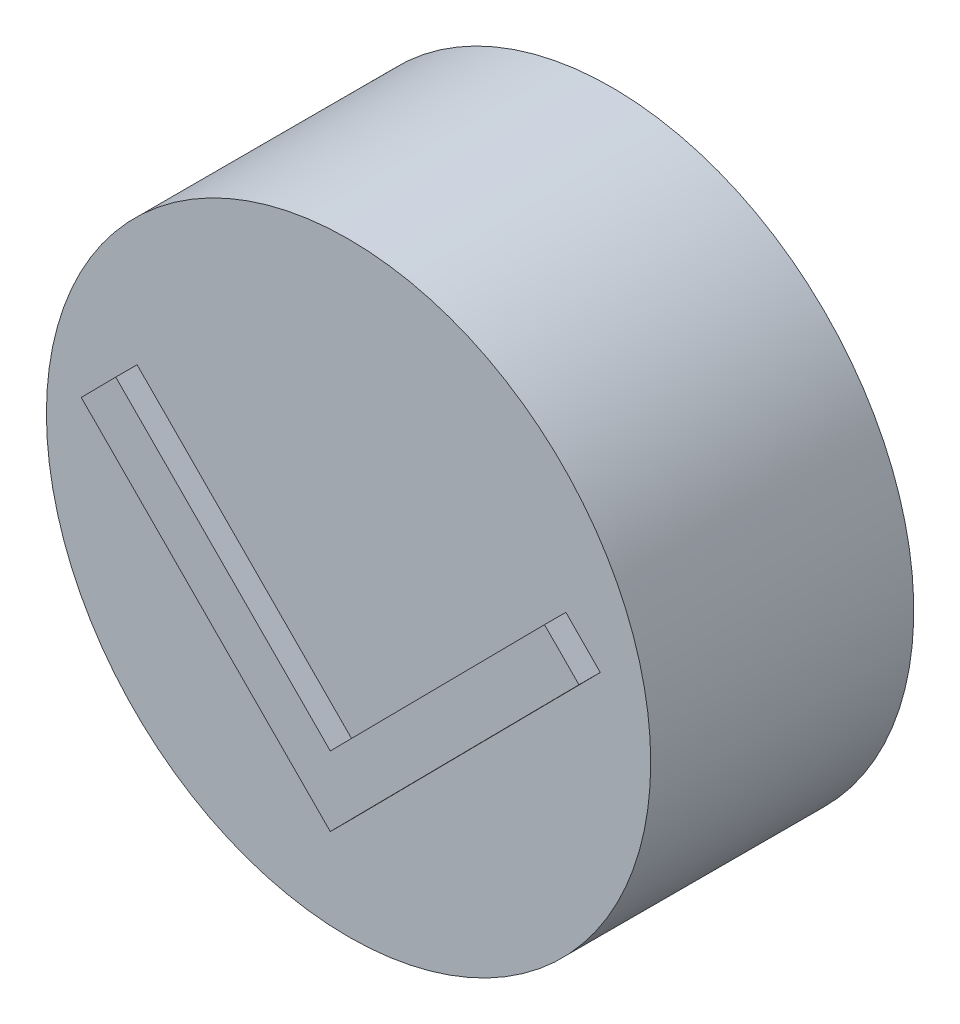
ISO-10303-21;
HEADER;
FILE_DESCRIPTION(('STEP AP214'),'2;1');
FILE_NAME('part.step','',(''),(''),'','','');
FILE_SCHEMA(('AUTOMOTIVE_DESIGN { 1 0 10303 214 1 1 1 1 }'));
ENDSEC;
DATA;
#1=APPLICATION_CONTEXT('core data for automotive mechanical design processes');
#2=APPLICATION_PROTOCOL_DEFINITION('international standard','automotive_design',2000,#1);
#3=PRODUCT_CONTEXT('',#1,'mechanical');
#4=PRODUCT('Part','Part','',(#3));
#5=PRODUCT_RELATED_PRODUCT_CATEGORY('part','',(#4));
#6=PRODUCT_DEFINITION_FORMATION('','',#4);
#7=PRODUCT_DEFINITION_CONTEXT('part definition',#1,'design');
#8=PRODUCT_DEFINITION('design','',#6,#7);
#9=PRODUCT_DEFINITION_SHAPE('','',#8);
#10=(LENGTH_UNIT() NAMED_UNIT(*) SI_UNIT(.MILLI.,.METRE.));
#11=(NAMED_UNIT(*) PLANE_ANGLE_UNIT() SI_UNIT($,.RADIAN.));
#12=(NAMED_UNIT(*) SI_UNIT($,.STERADIAN.) SOLID_ANGLE_UNIT());
#13=UNCERTAINTY_MEASURE_WITH_UNIT(LENGTH_MEASURE(1.E-05),#10,'distance_accuracy_value','');
#14=(GEOMETRIC_REPRESENTATION_CONTEXT(3) GLOBAL_UNCERTAINTY_ASSIGNED_CONTEXT((#13)) GLOBAL_UNIT_ASSIGNED_CONTEXT((#10,
#11,#12)) REPRESENTATION_CONTEXT('',''));
#15=CARTESIAN_POINT('',(0.,0.,0.));
#16=DIRECTION('',(0.,0.,1.));
#17=DIRECTION('',(1.,0.,0.));
#18=AXIS2_PLACEMENT_3D('',#15,#16,#17);
#19=CARTESIAN_POINT('',(0.,0.,-3.));
#20=DIRECTION('',(0.,0.,-1.));
#21=DIRECTION('',(-1.,0.,0.));
#22=AXIS2_PLACEMENT_3D('',#19,#20,#21);
#23=PLANE('',#22);
#24=CARTESIAN_POINT('',(0.,0.,-3.));
#25=DIRECTION('',(0.,0.,-1.));
#26=DIRECTION('',(-1.,0.,0.));
#27=AXIS2_PLACEMENT_3D('',#24,#25,#26);
#28=CIRCLE('',#27,8.5);
#29=CARTESIAN_POINT('',(-8.5,0.,-3.));
#30=VERTEX_POINT('',#29);
#31=EDGE_CURVE('E149',#30,#30,#28,.T.);
#32=ORIENTED_EDGE('',*,*,#31,.T.);
#33=EDGE_LOOP('',(#32));
#34=FACE_BOUND('',#33,.T.);
#35=CARTESIAN_POINT('',(0.,0.,-3.));
#36=DIRECTION('',(0.,0.,-1.));
#37=DIRECTION('',(-1.,0.,0.));
#38=AXIS2_PLACEMENT_3D('',#35,#36,#37);
#39=CIRCLE('',#38,7.5);
#40=CARTESIAN_POINT('',(-7.5,0.,-3.));
#41=VERTEX_POINT('',#40);
#42=EDGE_CURVE('E146',#41,#41,#39,.T.);
#43=ORIENTED_EDGE('',*,*,#42,.F.);
#44=EDGE_LOOP('',(#43));
#45=FACE_BOUND('',#44,.T.);
#46=ADVANCED_FACE('F33',(#34,#45),#23,.T.);
#47=CARTESIAN_POINT('',(0.,0.,-3.));
#48=DIRECTION('',(0.,0.,1.));
#49=DIRECTION('',(1.,0.,0.));
#50=AXIS2_PLACEMENT_3D('',#47,#48,#49);
#51=CYLINDRICAL_SURFACE('',#50,7.5);
#52=ORIENTED_EDGE('',*,*,#42,.T.);
#53=EDGE_LOOP('',(#52));
#54=FACE_BOUND('',#53,.T.);
#55=CARTESIAN_POINT('',(0.,0.,0.));
#56=DIRECTION('',(0.,0.,-1.));
#57=DIRECTION('',(-1.,0.,0.));
#58=AXIS2_PLACEMENT_3D('',#55,#56,#57);
#59=CIRCLE('',#58,7.5);
#60=CARTESIAN_POINT('',(-7.5,0.,0.));
#61=VERTEX_POINT('',#60);
#62=EDGE_CURVE('E131',#61,#61,#59,.T.);
#63=ORIENTED_EDGE('',*,*,#62,.F.);
#64=EDGE_LOOP('',(#63));
#65=FACE_BOUND('',#64,.T.);
#66=ADVANCED_FACE('F176',(#54,#65),#51,.F.);
#67=CARTESIAN_POINT('',(0.,0.,4.4));
#68=DIRECTION('',(0.,0.,1.));
#69=DIRECTION('',(1.,0.,0.));
#70=AXIS2_PLACEMENT_3D('',#67,#68,#69);
#71=PLANE('',#70);
#72=DIRECTION('',(-0.703148659085911,-0.711042870174285,0.));
#73=VECTOR('',#72,1.);
#74=CARTESIAN_POINT('',(7.08045306664169,1.48129444493331,4.4));
#75=LINE('',#74,#73);
#76=CARTESIAN_POINT('',(7.08045306664169,1.48129444493331,4.4));
#77=VERTEX_POINT('',#76);
#78=CARTESIAN_POINT('',(0.086062041000666,-5.59162222173336,4.4));
#79=VERTEX_POINT('',#78);
#80=EDGE_CURVE('E122',#77,#79,#75,.T.);
#81=ORIENTED_EDGE('',*,*,#80,.T.);
#82=DIRECTION('',(-0.703718148678092,0.710479251787889,0.));
#83=VECTOR('',#82,1.);
#84=CARTESIAN_POINT('',(0.086062041000666,-5.59162222173336,4.4));
#85=LINE('',#84,#83);
#86=CARTESIAN_POINT('',(-6.91954693335831,1.48129444493331,4.4));
#87=VERTEX_POINT('',#86);
#88=EDGE_CURVE('E91',#79,#87,#85,.T.);
#89=ORIENTED_EDGE('',*,*,#88,.T.);
#90=DIRECTION('',(0.703031338833088,0.711158868761795,0.));
#91=VECTOR('',#90,1.);
#92=CARTESIAN_POINT('',(-6.91954693335831,1.48129444493331,4.4));
#93=LINE('',#92,#91);
#94=CARTESIAN_POINT('',(-5.94919436925574,2.46286495775382,4.4));
#95=VERTEX_POINT('',#94);
#96=EDGE_CURVE('E125',#87,#95,#93,.T.);
#97=ORIENTED_EDGE('',*,*,#96,.T.);
#98=DIRECTION('',(0.703828638271255,-0.710369796619501,0.));
#99=VECTOR('',#98,1.);
#100=CARTESIAN_POINT('',(-5.94919436925574,2.46286495775382,4.4));
#101=LINE('',#100,#99);
#102=CARTESIAN_POINT('',(0.086062041000666,-3.62848119609233,4.4));
#103=VERTEX_POINT('',#102);
#104=EDGE_CURVE('E127',#95,#103,#101,.T.);
#105=ORIENTED_EDGE('',*,*,#104,.T.);
#106=DIRECTION('',(0.703332999987337,0.710860528605163,0.));
#107=VECTOR('',#106,1.);
#108=CARTESIAN_POINT('',(0.086062041000666,-3.62848119609233,4.4));
#109=LINE('',#108,#107);
#110=CARTESIAN_POINT('',(6.11290498971862,2.46286495775382,4.4));
#111=VERTEX_POINT('',#110);
#112=EDGE_CURVE('E53',#103,#111,#109,.T.);
#113=ORIENTED_EDGE('',*,*,#112,.T.);
#114=DIRECTION('',(0.702001515475607,-0.7121754504825,0.));
#115=VECTOR('',#114,1.);
#116=CARTESIAN_POINT('',(6.11290498971862,2.46286495775382,4.4));
#117=LINE('',#116,#115);
#118=EDGE_CURVE('E48',#111,#77,#117,.T.);
#119=ORIENTED_EDGE('',*,*,#118,.T.);
#120=EDGE_LOOP('',(#81,#89,#97,#105,#113,#119));
#121=FACE_BOUND('',#120,.T.);
#122=CARTESIAN_POINT('',(0.,0.,4.4));
#123=DIRECTION('',(0.,0.,1.));
#124=DIRECTION('',(1.,0.,0.));
#125=AXIS2_PLACEMENT_3D('',#122,#123,#124);
#126=CIRCLE('',#125,8.5);
#127=CARTESIAN_POINT('',(8.5,0.,4.4));
#128=VERTEX_POINT('',#127);
#129=EDGE_CURVE('E11',#128,#128,#126,.T.);
#130=ORIENTED_EDGE('',*,*,#129,.T.);
#131=EDGE_LOOP('',(#130));
#132=FACE_BOUND('',#131,.T.);
#133=ADVANCED_FACE('F171',(#121,#132),#71,.T.);
#134=CARTESIAN_POINT('',(0.,0.,4.4));
#135=DIRECTION('',(0.,0.,-1.));
#136=DIRECTION('',(-1.,0.,0.));
#137=AXIS2_PLACEMENT_3D('',#134,#135,#136);
#138=CYLINDRICAL_SURFACE('',#137,8.5);
#139=ORIENTED_EDGE('',*,*,#129,.F.);
#140=EDGE_LOOP('',(#139));
#141=FACE_BOUND('',#140,.T.);
#142=ORIENTED_EDGE('',*,*,#31,.F.);
#143=EDGE_LOOP('',(#142));
#144=FACE_BOUND('',#143,.T.);
#145=ADVANCED_FACE('F35',(#141,#144),#138,.T.);
#146=CARTESIAN_POINT('',(0.,0.,1.69999999999998));
#147=DIRECTION('',(0.,0.,-1.));
#148=DIRECTION('',(-1.,0.,0.));
#149=AXIS2_PLACEMENT_3D('',#146,#147,#148);
#150=CONICAL_SURFACE('',#149,5.8,0.785398163397454);
#151=ORIENTED_EDGE('',*,*,#62,.T.);
#152=EDGE_LOOP('',(#151));
#153=FACE_BOUND('',#152,.T.);
#154=CARTESIAN_POINT('',(0.,0.,1.69999999999998));
#155=DIRECTION('',(0.,0.,-1.));
#156=DIRECTION('',(-1.,0.,0.));
#157=AXIS2_PLACEMENT_3D('',#154,#155,#156);
#158=CIRCLE('',#157,5.8);
#159=CARTESIAN_POINT('',(-5.8,0.,1.69999999999998));
#160=VERTEX_POINT('',#159);
#161=EDGE_CURVE('E143',#160,#160,#158,.T.);
#162=ORIENTED_EDGE('',*,*,#161,.F.);
#163=EDGE_LOOP('',(#162));
#164=FACE_BOUND('',#163,.T.);
#165=ADVANCED_FACE('F162',(#153,#164),#150,.F.);
#166=CARTESIAN_POINT('',(0.,0.,4.));
#167=DIRECTION('',(0.,0.,-1.));
#168=DIRECTION('',(-1.,0.,0.));
#169=AXIS2_PLACEMENT_3D('',#166,#167,#168);
#170=PLANE('',#169);
#171=CARTESIAN_POINT('',(0.,0.,4.));
#172=DIRECTION('',(0.,0.,-1.));
#173=DIRECTION('',(-1.,0.,0.));
#174=AXIS2_PLACEMENT_3D('',#171,#172,#173);
#175=CIRCLE('',#174,5.8);
#176=CARTESIAN_POINT('',(-5.8,0.,4.));
#177=VERTEX_POINT('',#176);
#178=EDGE_CURVE('E41',#177,#177,#175,.T.);
#179=ORIENTED_EDGE('',*,*,#178,.T.);
#180=EDGE_LOOP('',(#179));
#181=FACE_BOUND('',#180,.T.);
#182=ADVANCED_FACE('F154',(#181),#170,.T.);
#183=CARTESIAN_POINT('',(0.,0.,4.));
#184=DIRECTION('',(0.,0.,-1.));
#185=DIRECTION('',(-1.,0.,0.));
#186=AXIS2_PLACEMENT_3D('',#183,#184,#185);
#187=CYLINDRICAL_SURFACE('',#186,5.8);
#188=ORIENTED_EDGE('',*,*,#178,.F.);
#189=EDGE_LOOP('',(#188));
#190=FACE_BOUND('',#189,.T.);
#191=ORIENTED_EDGE('',*,*,#161,.T.);
#192=EDGE_LOOP('',(#191));
#193=FACE_BOUND('',#192,.T.);
#194=ADVANCED_FACE('F156',(#190,#193),#187,.F.);
#195=CARTESIAN_POINT('',(7.08045306664169,1.48129444493331,5.));
#196=DIRECTION('',(0.711042870174285,-0.703148659085911,0.));
#197=DIRECTION('',(0.703148659085911,0.711042870174285,0.));
#198=AXIS2_PLACEMENT_3D('',#195,#196,#197);
#199=PLANE('',#198);
#200=ORIENTED_EDGE('',*,*,#80,.F.);
#201=DIRECTION('',(0.,0.,-1.));
#202=VECTOR('',#201,1.);
#203=CARTESIAN_POINT('',(7.08045306664169,1.48129444493331,5.));
#204=LINE('',#203,#202);
#205=CARTESIAN_POINT('',(7.08045306664169,1.48129444493331,5.));
#206=VERTEX_POINT('',#205);
#207=EDGE_CURVE('E110',#206,#77,#204,.T.);
#208=ORIENTED_EDGE('',*,*,#207,.F.);
#209=DIRECTION('',(-0.703148659085911,-0.711042870174285,0.));
#210=VECTOR('',#209,1.);
#211=CARTESIAN_POINT('',(7.08045306664169,1.48129444493331,5.));
#212=LINE('',#211,#210);
#213=CARTESIAN_POINT('',(0.086062041000666,-5.59162222173336,5.));
#214=VERTEX_POINT('',#213);
#215=EDGE_CURVE('E103',#206,#214,#212,.T.);
#216=ORIENTED_EDGE('',*,*,#215,.T.);
#217=DIRECTION('',(0.,0.,-1.));
#218=VECTOR('',#217,1.);
#219=CARTESIAN_POINT('',(0.086062041000666,-5.59162222173336,5.));
#220=LINE('',#219,#218);
#221=EDGE_CURVE('E86',#214,#79,#220,.T.);
#222=ORIENTED_EDGE('',*,*,#221,.T.);
#223=EDGE_LOOP('',(#200,#208,#216,#222));
#224=FACE_BOUND('',#223,.T.);
#225=ADVANCED_FACE('F109',(#224),#199,.T.);
#226=CARTESIAN_POINT('',(6.11290498971862,2.46286495775382,5.));
#227=DIRECTION('',(0.7121754504825,0.702001515475607,0.));
#228=DIRECTION('',(-0.702001515475607,0.7121754504825,0.));
#229=AXIS2_PLACEMENT_3D('',#226,#227,#228);
#230=PLANE('',#229);
#231=ORIENTED_EDGE('',*,*,#118,.F.);
#232=DIRECTION('',(0.,0.,-1.));
#233=VECTOR('',#232,1.);
#234=CARTESIAN_POINT('',(6.11290498971862,2.46286495775382,5.));
#235=LINE('',#234,#233);
#236=CARTESIAN_POINT('',(6.11290498971862,2.46286495775382,5.));
#237=VERTEX_POINT('',#236);
#238=EDGE_CURVE('E132',#237,#111,#235,.T.);
#239=ORIENTED_EDGE('',*,*,#238,.F.);
#240=DIRECTION('',(0.702001515475607,-0.7121754504825,0.));
#241=VECTOR('',#240,1.);
#242=CARTESIAN_POINT('',(6.11290498971862,2.46286495775382,5.));
#243=LINE('',#242,#241);
#244=EDGE_CURVE('E96',#237,#206,#243,.T.);
#245=ORIENTED_EDGE('',*,*,#244,.T.);
#246=ORIENTED_EDGE('',*,*,#207,.T.);
#247=EDGE_LOOP('',(#231,#239,#245,#246));
#248=FACE_BOUND('',#247,.T.);
#249=ADVANCED_FACE('F201',(#248),#230,.T.);
#250=CARTESIAN_POINT('',(0.086062041000666,-3.62848119609233,5.));
#251=DIRECTION('',(-0.710860528605163,0.703332999987337,0.));
#252=DIRECTION('',(-0.703332999987337,-0.710860528605163,0.));
#253=AXIS2_PLACEMENT_3D('',#250,#251,#252);
#254=PLANE('',#253);
#255=ORIENTED_EDGE('',*,*,#112,.F.);
#256=DIRECTION('',(0.,0.,-1.));
#257=VECTOR('',#256,1.);
#258=CARTESIAN_POINT('',(0.086062041000666,-3.62848119609233,5.));
#259=LINE('',#258,#257);
#260=CARTESIAN_POINT('',(0.086062041000666,-3.62848119609233,5.));
#261=VERTEX_POINT('',#260);
#262=EDGE_CURVE('E134',#261,#103,#259,.T.);
#263=ORIENTED_EDGE('',*,*,#262,.F.);
#264=DIRECTION('',(0.703332999987337,0.710860528605163,0.));
#265=VECTOR('',#264,1.);
#266=CARTESIAN_POINT('',(0.086062041000666,-3.62848119609233,5.));
#267=LINE('',#266,#265);
#268=EDGE_CURVE('E118',#261,#237,#267,.T.);
#269=ORIENTED_EDGE('',*,*,#268,.T.);
#270=ORIENTED_EDGE('',*,*,#238,.T.);
#271=EDGE_LOOP('',(#255,#263,#269,#270));
#272=FACE_BOUND('',#271,.T.);
#273=ADVANCED_FACE('F199',(#272),#254,.T.);
#274=CARTESIAN_POINT('',(-5.94919436925574,2.46286495775382,5.));
#275=DIRECTION('',(0.710369796619501,0.703828638271255,0.));
#276=DIRECTION('',(-0.703828638271255,0.710369796619501,0.));
#277=AXIS2_PLACEMENT_3D('',#274,#275,#276);
#278=PLANE('',#277);
#279=ORIENTED_EDGE('',*,*,#104,.F.);
#280=DIRECTION('',(0.,0.,-1.));
#281=VECTOR('',#280,1.);
#282=CARTESIAN_POINT('',(-5.94919436925574,2.46286495775382,5.));
#283=LINE('',#282,#281);
#284=CARTESIAN_POINT('',(-5.94919436925574,2.46286495775382,5.));
#285=VERTEX_POINT('',#284);
#286=EDGE_CURVE('E137',#285,#95,#283,.T.);
#287=ORIENTED_EDGE('',*,*,#286,.F.);
#288=DIRECTION('',(0.703828638271255,-0.710369796619501,0.));
#289=VECTOR('',#288,1.);
#290=CARTESIAN_POINT('',(-5.94919436925574,2.46286495775382,5.));
#291=LINE('',#290,#289);
#292=EDGE_CURVE('E115',#285,#261,#291,.T.);
#293=ORIENTED_EDGE('',*,*,#292,.T.);
#294=ORIENTED_EDGE('',*,*,#262,.T.);
#295=EDGE_LOOP('',(#279,#287,#293,#294));
#296=FACE_BOUND('',#295,.T.);
#297=ADVANCED_FACE('F196',(#296),#278,.T.);
#298=CARTESIAN_POINT('',(-6.91954693335831,1.48129444493331,5.));
#299=DIRECTION('',(-0.711158868761795,0.703031338833088,0.));
#300=DIRECTION('',(-0.703031338833088,-0.711158868761795,0.));
#301=AXIS2_PLACEMENT_3D('',#298,#299,#300);
#302=PLANE('',#301);
#303=ORIENTED_EDGE('',*,*,#96,.F.);
#304=DIRECTION('',(0.,0.,-1.));
#305=VECTOR('',#304,1.);
#306=CARTESIAN_POINT('',(-6.91954693335831,1.48129444493331,5.));
#307=LINE('',#306,#305);
#308=CARTESIAN_POINT('',(-6.91954693335831,1.48129444493331,5.));
#309=VERTEX_POINT('',#308);
#310=EDGE_CURVE('E95',#309,#87,#307,.T.);
#311=ORIENTED_EDGE('',*,*,#310,.F.);
#312=DIRECTION('',(0.703031338833088,0.711158868761795,0.));
#313=VECTOR('',#312,1.);
#314=CARTESIAN_POINT('',(-6.91954693335831,1.48129444493331,5.));
#315=LINE('',#314,#313);
#316=EDGE_CURVE('E107',#309,#285,#315,.T.);
#317=ORIENTED_EDGE('',*,*,#316,.T.);
#318=ORIENTED_EDGE('',*,*,#286,.T.);
#319=EDGE_LOOP('',(#303,#311,#317,#318));
#320=FACE_BOUND('',#319,.T.);
#321=ADVANCED_FACE('F193',(#320),#302,.T.);
#322=CARTESIAN_POINT('',(0.086062041000666,-5.59162222173336,5.));
#323=DIRECTION('',(-0.710479251787889,-0.703718148678092,0.));
#324=DIRECTION('',(0.703718148678092,-0.710479251787889,0.));
#325=AXIS2_PLACEMENT_3D('',#322,#323,#324);
#326=PLANE('',#325);
#327=ORIENTED_EDGE('',*,*,#88,.F.);
#328=ORIENTED_EDGE('',*,*,#221,.F.);
#329=DIRECTION('',(-0.703718148678092,0.710479251787889,0.));
#330=VECTOR('',#329,1.);
#331=CARTESIAN_POINT('',(0.086062041000666,-5.59162222173336,5.));
#332=LINE('',#331,#330);
#333=EDGE_CURVE('E90',#214,#309,#332,.T.);
#334=ORIENTED_EDGE('',*,*,#333,.T.);
#335=ORIENTED_EDGE('',*,*,#310,.T.);
#336=EDGE_LOOP('',(#327,#328,#334,#335));
#337=FACE_BOUND('',#336,.T.);
#338=ADVANCED_FACE('F88',(#337),#326,.T.);
#339=CARTESIAN_POINT('',(0.,0.,5.));
#340=DIRECTION('',(0.,0.,1.));
#341=DIRECTION('',(1.,0.,0.));
#342=AXIS2_PLACEMENT_3D('',#339,#340,#341);
#343=PLANE('',#342);
#344=ORIENTED_EDGE('',*,*,#215,.F.);
#345=ORIENTED_EDGE('',*,*,#244,.F.);
#346=ORIENTED_EDGE('',*,*,#268,.F.);
#347=ORIENTED_EDGE('',*,*,#292,.F.);
#348=ORIENTED_EDGE('',*,*,#316,.F.);
#349=ORIENTED_EDGE('',*,*,#333,.F.);
#350=EDGE_LOOP('',(#344,#345,#346,#347,#348,#349));
#351=FACE_BOUND('',#350,.T.);
#352=ADVANCED_FACE('F101',(#351),#343,.T.);
#353=CLOSED_SHELL('',(#46,#66,#133,#145,#165,#182,#194,#225,#249,#273,#297,#321,#338,#352));
#354=MANIFOLD_SOLID_BREP('B2',#353);
#355=ADVANCED_BREP_SHAPE_REPRESENTATION('',(#18,#354),#14);
#356=SHAPE_DEFINITION_REPRESENTATION(#9,#355);
ENDSEC;
END-ISO-10303-21;
